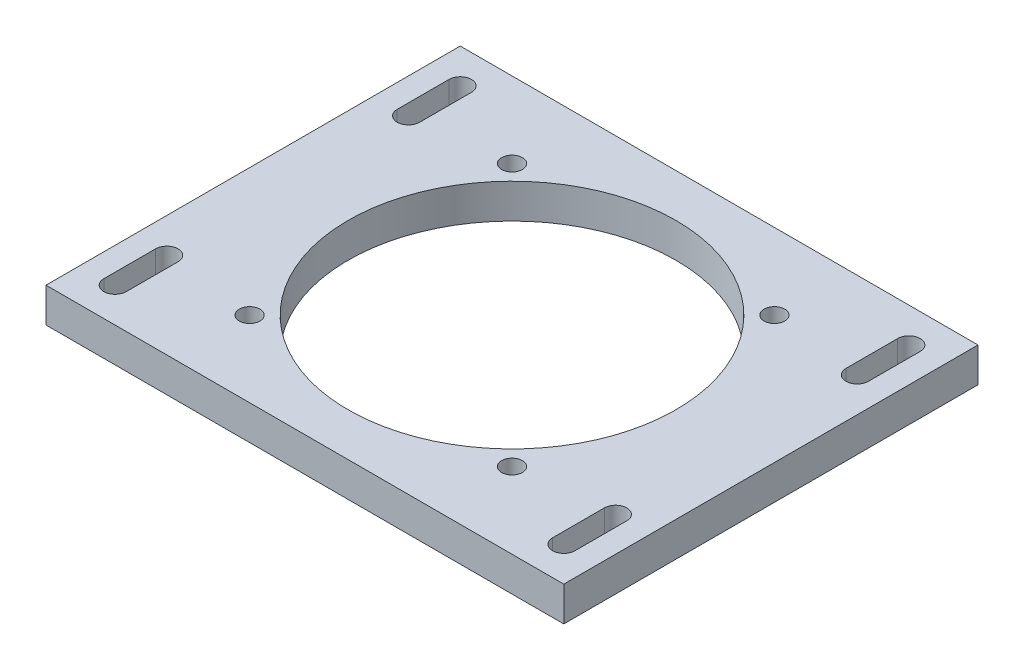
ISO-10303-21;
HEADER;
FILE_DESCRIPTION(('STEP AP214'),'2;1');
FILE_NAME('part.step','',(''),(''),'','','');
FILE_SCHEMA(('AUTOMOTIVE_DESIGN { 1 0 10303 214 1 1 1 1 }'));
ENDSEC;
DATA;
#1=APPLICATION_CONTEXT('core data for automotive mechanical design processes');
#2=APPLICATION_PROTOCOL_DEFINITION('international standard','automotive_design',2000,#1);
#3=PRODUCT_CONTEXT('',#1,'mechanical');
#4=PRODUCT('Part','Part','',(#3));
#5=PRODUCT_RELATED_PRODUCT_CATEGORY('part','',(#4));
#6=PRODUCT_DEFINITION_FORMATION('','',#4);
#7=PRODUCT_DEFINITION_CONTEXT('part definition',#1,'design');
#8=PRODUCT_DEFINITION('design','',#6,#7);
#9=PRODUCT_DEFINITION_SHAPE('','',#8);
#10=(LENGTH_UNIT() NAMED_UNIT(*) SI_UNIT(.MILLI.,.METRE.));
#11=(NAMED_UNIT(*) PLANE_ANGLE_UNIT() SI_UNIT($,.RADIAN.));
#12=(NAMED_UNIT(*) SI_UNIT($,.STERADIAN.) SOLID_ANGLE_UNIT());
#13=UNCERTAINTY_MEASURE_WITH_UNIT(LENGTH_MEASURE(1.E-05),#10,'distance_accuracy_value','');
#14=(GEOMETRIC_REPRESENTATION_CONTEXT(3) GLOBAL_UNCERTAINTY_ASSIGNED_CONTEXT((#13)) GLOBAL_UNIT_ASSIGNED_CONTEXT((#10,
#11,#12)) REPRESENTATION_CONTEXT('',''));
#15=CARTESIAN_POINT('',(0.,0.,0.));
#16=DIRECTION('',(0.,0.,1.));
#17=DIRECTION('',(1.,0.,0.));
#18=AXIS2_PLACEMENT_3D('',#15,#16,#17);
#19=CARTESIAN_POINT('',(0.,20.,0.));
#20=DIRECTION('',(0.,-1.,0.));
#21=DIRECTION('',(0.,0.,-1.));
#22=AXIS2_PLACEMENT_3D('',#19,#20,#21);
#23=PLANE('',#22);
#24=DIRECTION('',(0.,0.,-1.));
#25=VECTOR('',#24,1.);
#26=CARTESIAN_POINT('',(-123.5,20.,70.));
#27=LINE('',#26,#25);
#28=CARTESIAN_POINT('',(-123.5,20.,70.));
#29=VERTEX_POINT('',#28);
#30=CARTESIAN_POINT('',(-123.5,20.,100.));
#31=VERTEX_POINT('',#30);
#32=EDGE_CURVE('E160',#29,#31,#27,.F.);
#33=ORIENTED_EDGE('',*,*,#32,.T.);
#34=CARTESIAN_POINT('',(-130.,20.,100.));
#35=DIRECTION('',(0.,1.,0.));
#36=DIRECTION('',(0.,0.,1.));
#37=AXIS2_PLACEMENT_3D('',#34,#35,#36);
#38=CIRCLE('',#37,6.5);
#39=CARTESIAN_POINT('',(-136.5,20.,100.));
#40=VERTEX_POINT('',#39);
#41=EDGE_CURVE('E232',#31,#40,#38,.F.);
#42=ORIENTED_EDGE('',*,*,#41,.T.);
#43=DIRECTION('',(0.,0.,1.));
#44=VECTOR('',#43,1.);
#45=CARTESIAN_POINT('',(-136.5,20.,70.));
#46=LINE('',#45,#44);
#47=CARTESIAN_POINT('',(-136.5,20.,70.));
#48=VERTEX_POINT('',#47);
#49=EDGE_CURVE('E165',#40,#48,#46,.F.);
#50=ORIENTED_EDGE('',*,*,#49,.T.);
#51=CARTESIAN_POINT('',(-130.,20.,70.));
#52=DIRECTION('',(0.,1.,0.));
#53=DIRECTION('',(0.,0.,1.));
#54=AXIS2_PLACEMENT_3D('',#51,#52,#53);
#55=CIRCLE('',#54,6.5);
#56=EDGE_CURVE('E173',#48,#29,#55,.F.);
#57=ORIENTED_EDGE('',*,*,#56,.T.);
#58=EDGE_LOOP('',(#33,#42,#50,#57));
#59=FACE_BOUND('',#58,.T.);
#60=DIRECTION('',(0.,0.,-1.));
#61=VECTOR('',#60,1.);
#62=CARTESIAN_POINT('',(136.5,20.,70.));
#63=LINE('',#62,#61);
#64=CARTESIAN_POINT('',(136.5,20.,70.));
#65=VERTEX_POINT('',#64);
#66=CARTESIAN_POINT('',(136.5,20.,100.));
#67=VERTEX_POINT('',#66);
#68=EDGE_CURVE('E170',#65,#67,#63,.F.);
#69=ORIENTED_EDGE('',*,*,#68,.T.);
#70=CARTESIAN_POINT('',(130.,20.,100.));
#71=DIRECTION('',(0.,1.,0.));
#72=DIRECTION('',(0.,0.,1.));
#73=AXIS2_PLACEMENT_3D('',#70,#71,#72);
#74=CIRCLE('',#73,6.5);
#75=CARTESIAN_POINT('',(123.5,20.,100.));
#76=VERTEX_POINT('',#75);
#77=EDGE_CURVE('E236',#67,#76,#74,.F.);
#78=ORIENTED_EDGE('',*,*,#77,.T.);
#79=DIRECTION('',(0.,0.,1.));
#80=VECTOR('',#79,1.);
#81=CARTESIAN_POINT('',(123.5,20.,70.));
#82=LINE('',#81,#80);
#83=CARTESIAN_POINT('',(123.5,20.,70.));
#84=VERTEX_POINT('',#83);
#85=EDGE_CURVE('E175',#76,#84,#82,.F.);
#86=ORIENTED_EDGE('',*,*,#85,.T.);
#87=CARTESIAN_POINT('',(130.,20.,70.));
#88=DIRECTION('',(0.,1.,0.));
#89=DIRECTION('',(0.,0.,1.));
#90=AXIS2_PLACEMENT_3D('',#87,#88,#89);
#91=CIRCLE('',#90,6.5);
#92=EDGE_CURVE('E239',#84,#65,#91,.F.);
#93=ORIENTED_EDGE('',*,*,#92,.T.);
#94=EDGE_LOOP('',(#69,#78,#86,#93));
#95=FACE_BOUND('',#94,.T.);
#96=DIRECTION('',(1.,0.,0.));
#97=VECTOR('',#96,1.);
#98=CARTESIAN_POINT('',(-150.,20.,-120.));
#99=LINE('',#98,#97);
#100=CARTESIAN_POINT('',(150.,20.,-120.));
#101=VERTEX_POINT('',#100);
#102=CARTESIAN_POINT('',(-150.,20.,-120.));
#103=VERTEX_POINT('',#102);
#104=EDGE_CURVE('E578',#101,#103,#99,.F.);
#105=ORIENTED_EDGE('',*,*,#104,.T.);
#106=DIRECTION('',(0.,0.,-1.));
#107=VECTOR('',#106,1.);
#108=CARTESIAN_POINT('',(-150.,20.,120.));
#109=LINE('',#108,#107);
#110=CARTESIAN_POINT('',(-150.,20.,120.));
#111=VERTEX_POINT('',#110);
#112=EDGE_CURVE('E587',#103,#111,#109,.F.);
#113=ORIENTED_EDGE('',*,*,#112,.T.);
#114=DIRECTION('',(-1.,0.,0.));
#115=VECTOR('',#114,1.);
#116=CARTESIAN_POINT('',(-150.,20.,120.));
#117=LINE('',#116,#115);
#118=CARTESIAN_POINT('',(150.,20.,120.));
#119=VERTEX_POINT('',#118);
#120=EDGE_CURVE('E593',#111,#119,#117,.F.);
#121=ORIENTED_EDGE('',*,*,#120,.T.);
#122=DIRECTION('',(0.,0.,1.));
#123=VECTOR('',#122,1.);
#124=CARTESIAN_POINT('',(150.,20.,120.));
#125=LINE('',#124,#123);
#126=EDGE_CURVE('E183',#119,#101,#125,.F.);
#127=ORIENTED_EDGE('',*,*,#126,.T.);
#128=EDGE_LOOP('',(#105,#113,#121,#127));
#129=FACE_BOUND('',#128,.T.);
#130=CARTESIAN_POINT('',(130.,20.,-100.));
#131=DIRECTION('',(0.,1.,0.));
#132=DIRECTION('',(0.,0.,1.));
#133=AXIS2_PLACEMENT_3D('',#130,#131,#132);
#134=CIRCLE('',#133,6.5);
#135=CARTESIAN_POINT('',(123.5,20.,-100.));
#136=VERTEX_POINT('',#135);
#137=CARTESIAN_POINT('',(136.5,20.,-100.));
#138=VERTEX_POINT('',#137);
#139=EDGE_CURVE('E191',#136,#138,#134,.F.);
#140=ORIENTED_EDGE('',*,*,#139,.T.);
#141=DIRECTION('',(0.,0.,-1.));
#142=VECTOR('',#141,1.);
#143=CARTESIAN_POINT('',(136.5,20.,-100.));
#144=LINE('',#143,#142);
#145=CARTESIAN_POINT('',(136.5,20.,-70.));
#146=VERTEX_POINT('',#145);
#147=EDGE_CURVE('E180',#138,#146,#144,.F.);
#148=ORIENTED_EDGE('',*,*,#147,.T.);
#149=CARTESIAN_POINT('',(130.,20.,-70.));
#150=DIRECTION('',(0.,1.,0.));
#151=DIRECTION('',(0.,0.,1.));
#152=AXIS2_PLACEMENT_3D('',#149,#150,#151);
#153=CIRCLE('',#152,6.5);
#154=CARTESIAN_POINT('',(123.5,20.,-70.));
#155=VERTEX_POINT('',#154);
#156=EDGE_CURVE('E242',#146,#155,#153,.F.);
#157=ORIENTED_EDGE('',*,*,#156,.T.);
#158=DIRECTION('',(0.,0.,1.));
#159=VECTOR('',#158,1.);
#160=CARTESIAN_POINT('',(123.5,20.,-100.));
#161=LINE('',#160,#159);
#162=EDGE_CURVE('E185',#155,#136,#161,.F.);
#163=ORIENTED_EDGE('',*,*,#162,.T.);
#164=EDGE_LOOP('',(#140,#148,#157,#163));
#165=FACE_BOUND('',#164,.T.);
#166=CARTESIAN_POINT('',(-130.,20.,-100.));
#167=DIRECTION('',(0.,1.,0.));
#168=DIRECTION('',(0.,0.,1.));
#169=AXIS2_PLACEMENT_3D('',#166,#167,#168);
#170=CIRCLE('',#169,6.5);
#171=CARTESIAN_POINT('',(-136.5,20.,-100.));
#172=VERTEX_POINT('',#171);
#173=CARTESIAN_POINT('',(-123.5,20.,-100.));
#174=VERTEX_POINT('',#173);
#175=EDGE_CURVE('E131',#172,#174,#170,.F.);
#176=ORIENTED_EDGE('',*,*,#175,.T.);
#177=DIRECTION('',(0.,0.,-1.));
#178=VECTOR('',#177,1.);
#179=CARTESIAN_POINT('',(-123.5,20.,-100.));
#180=LINE('',#179,#178);
#181=CARTESIAN_POINT('',(-123.5,20.,-70.));
#182=VERTEX_POINT('',#181);
#183=EDGE_CURVE('E190',#174,#182,#180,.F.);
#184=ORIENTED_EDGE('',*,*,#183,.T.);
#185=CARTESIAN_POINT('',(-130.,20.,-70.));
#186=DIRECTION('',(0.,1.,0.));
#187=DIRECTION('',(0.,0.,1.));
#188=AXIS2_PLACEMENT_3D('',#185,#186,#187);
#189=CIRCLE('',#188,6.5);
#190=CARTESIAN_POINT('',(-136.5,20.,-70.));
#191=VERTEX_POINT('',#190);
#192=EDGE_CURVE('E147',#182,#191,#189,.F.);
#193=ORIENTED_EDGE('',*,*,#192,.T.);
#194=DIRECTION('',(0.,0.,1.));
#195=VECTOR('',#194,1.);
#196=CARTESIAN_POINT('',(-136.5,20.,-100.));
#197=LINE('',#196,#195);
#198=EDGE_CURVE('E145',#191,#172,#197,.F.);
#199=ORIENTED_EDGE('',*,*,#198,.T.);
#200=EDGE_LOOP('',(#176,#184,#193,#199));
#201=FACE_BOUND('',#200,.T.);
#202=CARTESIAN_POINT('',(0.,20.,0.));
#203=DIRECTION('',(0.,-1.,0.));
#204=DIRECTION('',(0.,0.,-1.));
#205=AXIS2_PLACEMENT_3D('',#202,#203,#204);
#206=CIRCLE('',#205,95.);
#207=CARTESIAN_POINT('',(0.,20.,-95.));
#208=VERTEX_POINT('',#207);
#209=EDGE_CURVE('E142',#208,#208,#206,.T.);
#210=ORIENTED_EDGE('',*,*,#209,.T.);
#211=EDGE_LOOP('',(#210));
#212=FACE_BOUND('',#211,.T.);
#213=CARTESIAN_POINT('',(76.013978977554,20.,76.0139789775537));
#214=DIRECTION('',(0.,-1.,0.));
#215=DIRECTION('',(0.,0.,-1.));
#216=AXIS2_PLACEMENT_3D('',#213,#214,#215);
#217=CIRCLE('',#216,6.);
#218=CARTESIAN_POINT('',(76.013978977554,20.,70.0139789775537));
#219=VERTEX_POINT('',#218);
#220=EDGE_CURVE('E250',#219,#219,#217,.T.);
#221=ORIENTED_EDGE('',*,*,#220,.T.);
#222=EDGE_LOOP('',(#221));
#223=FACE_BOUND('',#222,.T.);
#224=CARTESIAN_POINT('',(-76.013978977554,20.,76.0139789775537));
#225=DIRECTION('',(0.,-1.,0.));
#226=DIRECTION('',(0.,0.,-1.));
#227=AXIS2_PLACEMENT_3D('',#224,#225,#226);
#228=CIRCLE('',#227,6.);
#229=CARTESIAN_POINT('',(-76.013978977554,20.,70.0139789775537));
#230=VERTEX_POINT('',#229);
#231=EDGE_CURVE('E253',#230,#230,#228,.T.);
#232=ORIENTED_EDGE('',*,*,#231,.T.);
#233=EDGE_LOOP('',(#232));
#234=FACE_BOUND('',#233,.T.);
#235=CARTESIAN_POINT('',(-76.013978977554,20.,-76.0139789775537));
#236=DIRECTION('',(0.,-1.,0.));
#237=DIRECTION('',(0.,0.,-1.));
#238=AXIS2_PLACEMENT_3D('',#235,#236,#237);
#239=CIRCLE('',#238,6.);
#240=CARTESIAN_POINT('',(-76.013978977554,20.,-82.0139789775537));
#241=VERTEX_POINT('',#240);
#242=EDGE_CURVE('E255',#241,#241,#239,.T.);
#243=ORIENTED_EDGE('',*,*,#242,.T.);
#244=EDGE_LOOP('',(#243));
#245=FACE_BOUND('',#244,.T.);
#246=CARTESIAN_POINT('',(76.0139789775545,20.,-76.0139789775532));
#247=DIRECTION('',(0.,-1.,0.));
#248=DIRECTION('',(0.,0.,-1.));
#249=AXIS2_PLACEMENT_3D('',#246,#247,#248);
#250=CIRCLE('',#249,6.);
#251=CARTESIAN_POINT('',(76.0139789775545,20.,-82.0139789775532));
#252=VERTEX_POINT('',#251);
#253=EDGE_CURVE('E19',#252,#252,#250,.T.);
#254=ORIENTED_EDGE('',*,*,#253,.T.);
#255=EDGE_LOOP('',(#254));
#256=FACE_BOUND('',#255,.T.);
#257=ADVANCED_FACE('F16',(#59,#95,#129,#165,#201,#212,#223,#234,#245,#256),#23,.F.);
#258=CARTESIAN_POINT('',(76.0139789775545,0.,-76.0139789775532));
#259=DIRECTION('',(0.,-1.,0.));
#260=DIRECTION('',(0.,0.,-1.));
#261=AXIS2_PLACEMENT_3D('',#258,#259,#260);
#262=CYLINDRICAL_SURFACE('',#261,6.);
#263=CARTESIAN_POINT('',(76.0139789775545,0.,-76.0139789775532));
#264=DIRECTION('',(0.,-1.,0.));
#265=DIRECTION('',(0.,0.,-1.));
#266=AXIS2_PLACEMENT_3D('',#263,#264,#265);
#267=CIRCLE('',#266,6.);
#268=CARTESIAN_POINT('',(76.0139789775545,0.,-82.0139789775532));
#269=VERTEX_POINT('',#268);
#270=EDGE_CURVE('E163',#269,#269,#267,.F.);
#271=ORIENTED_EDGE('',*,*,#270,.F.);
#272=EDGE_LOOP('',(#271));
#273=FACE_BOUND('',#272,.T.);
#274=ORIENTED_EDGE('',*,*,#253,.F.);
#275=EDGE_LOOP('',(#274));
#276=FACE_BOUND('',#275,.T.);
#277=ADVANCED_FACE('F263',(#273,#276),#262,.F.);
#278=CARTESIAN_POINT('',(-76.013978977554,0.,-76.0139789775537));
#279=DIRECTION('',(0.,-1.,0.));
#280=DIRECTION('',(0.,0.,-1.));
#281=AXIS2_PLACEMENT_3D('',#278,#279,#280);
#282=CYLINDRICAL_SURFACE('',#281,6.);
#283=CARTESIAN_POINT('',(-76.013978977554,0.,-76.0139789775537));
#284=DIRECTION('',(0.,-1.,0.));
#285=DIRECTION('',(0.,0.,-1.));
#286=AXIS2_PLACEMENT_3D('',#283,#284,#285);
#287=CIRCLE('',#286,6.);
#288=CARTESIAN_POINT('',(-76.013978977554,0.,-82.0139789775537));
#289=VERTEX_POINT('',#288);
#290=EDGE_CURVE('E227',#289,#289,#287,.F.);
#291=ORIENTED_EDGE('',*,*,#290,.F.);
#292=EDGE_LOOP('',(#291));
#293=FACE_BOUND('',#292,.T.);
#294=ORIENTED_EDGE('',*,*,#242,.F.);
#295=EDGE_LOOP('',(#294));
#296=FACE_BOUND('',#295,.T.);
#297=ADVANCED_FACE('F265',(#293,#296),#282,.F.);
#298=CARTESIAN_POINT('',(-76.013978977554,0.,76.0139789775537));
#299=DIRECTION('',(0.,-1.,0.));
#300=DIRECTION('',(0.,0.,-1.));
#301=AXIS2_PLACEMENT_3D('',#298,#299,#300);
#302=CYLINDRICAL_SURFACE('',#301,6.);
#303=CARTESIAN_POINT('',(-76.013978977554,0.,76.0139789775537));
#304=DIRECTION('',(0.,-1.,0.));
#305=DIRECTION('',(0.,0.,-1.));
#306=AXIS2_PLACEMENT_3D('',#303,#304,#305);
#307=CIRCLE('',#306,6.);
#308=CARTESIAN_POINT('',(-76.013978977554,0.,70.0139789775537));
#309=VERTEX_POINT('',#308);
#310=EDGE_CURVE('E224',#309,#309,#307,.F.);
#311=ORIENTED_EDGE('',*,*,#310,.F.);
#312=EDGE_LOOP('',(#311));
#313=FACE_BOUND('',#312,.T.);
#314=ORIENTED_EDGE('',*,*,#231,.F.);
#315=EDGE_LOOP('',(#314));
#316=FACE_BOUND('',#315,.T.);
#317=ADVANCED_FACE('F273',(#313,#316),#302,.F.);
#318=CARTESIAN_POINT('',(76.013978977554,0.,76.0139789775537));
#319=DIRECTION('',(0.,-1.,0.));
#320=DIRECTION('',(0.,0.,-1.));
#321=AXIS2_PLACEMENT_3D('',#318,#319,#320);
#322=CYLINDRICAL_SURFACE('',#321,6.);
#323=CARTESIAN_POINT('',(76.013978977554,0.,76.0139789775537));
#324=DIRECTION('',(0.,-1.,0.));
#325=DIRECTION('',(0.,0.,-1.));
#326=AXIS2_PLACEMENT_3D('',#323,#324,#325);
#327=CIRCLE('',#326,6.);
#328=CARTESIAN_POINT('',(76.013978977554,0.,70.0139789775537));
#329=VERTEX_POINT('',#328);
#330=EDGE_CURVE('E221',#329,#329,#327,.F.);
#331=ORIENTED_EDGE('',*,*,#330,.F.);
#332=EDGE_LOOP('',(#331));
#333=FACE_BOUND('',#332,.T.);
#334=ORIENTED_EDGE('',*,*,#220,.F.);
#335=EDGE_LOOP('',(#334));
#336=FACE_BOUND('',#335,.T.);
#337=ADVANCED_FACE('F365',(#333,#336),#322,.F.);
#338=CARTESIAN_POINT('',(0.,20.,0.));
#339=DIRECTION('',(0.,-1.,0.));
#340=DIRECTION('',(0.,0.,-1.));
#341=AXIS2_PLACEMENT_3D('',#338,#339,#340);
#342=CYLINDRICAL_SURFACE('',#341,95.);
#343=CARTESIAN_POINT('',(0.,0.,0.));
#344=DIRECTION('',(0.,-1.,0.));
#345=DIRECTION('',(0.,0.,-1.));
#346=AXIS2_PLACEMENT_3D('',#343,#344,#345);
#347=CIRCLE('',#346,95.);
#348=CARTESIAN_POINT('',(0.,0.,-95.));
#349=VERTEX_POINT('',#348);
#350=EDGE_CURVE('E218',#349,#349,#347,.F.);
#351=ORIENTED_EDGE('',*,*,#350,.F.);
#352=EDGE_LOOP('',(#351));
#353=FACE_BOUND('',#352,.T.);
#354=ORIENTED_EDGE('',*,*,#209,.F.);
#355=EDGE_LOOP('',(#354));
#356=FACE_BOUND('',#355,.T.);
#357=ADVANCED_FACE('F362',(#353,#356),#342,.F.);
#358=CARTESIAN_POINT('',(-130.,0.,-100.));
#359=DIRECTION('',(0.,1.,0.));
#360=DIRECTION('',(0.,0.,1.));
#361=AXIS2_PLACEMENT_3D('',#358,#359,#360);
#362=CYLINDRICAL_SURFACE('',#361,6.5);
#363=DIRECTION('',(0.,1.,0.));
#364=VECTOR('',#363,1.);
#365=CARTESIAN_POINT('',(-136.5,0.,-100.));
#366=LINE('',#365,#364);
#367=CARTESIAN_POINT('',(-136.5,0.,-100.));
#368=VERTEX_POINT('',#367);
#369=EDGE_CURVE('E135',#172,#368,#366,.F.);
#370=ORIENTED_EDGE('',*,*,#369,.T.);
#371=CARTESIAN_POINT('',(-130.,0.,-100.));
#372=DIRECTION('',(0.,1.,0.));
#373=DIRECTION('',(0.,0.,1.));
#374=AXIS2_PLACEMENT_3D('',#371,#372,#373);
#375=CIRCLE('',#374,6.5);
#376=CARTESIAN_POINT('',(-123.5,0.,-100.));
#377=VERTEX_POINT('',#376);
#378=EDGE_CURVE('E216',#377,#368,#375,.T.);
#379=ORIENTED_EDGE('',*,*,#378,.F.);
#380=DIRECTION('',(0.,1.,0.));
#381=VECTOR('',#380,1.);
#382=CARTESIAN_POINT('',(-123.5,0.,-100.));
#383=LINE('',#382,#381);
#384=EDGE_CURVE('E138',#377,#174,#383,.T.);
#385=ORIENTED_EDGE('',*,*,#384,.T.);
#386=ORIENTED_EDGE('',*,*,#175,.F.);
#387=EDGE_LOOP('',(#370,#379,#385,#386));
#388=FACE_BOUND('',#387,.T.);
#389=ADVANCED_FACE('F133',(#388),#362,.F.);
#390=CARTESIAN_POINT('',(-136.5,0.,-100.));
#391=DIRECTION('',(-1.,0.,0.));
#392=DIRECTION('',(0.,0.,1.));
#393=AXIS2_PLACEMENT_3D('',#390,#391,#392);
#394=PLANE('',#393);
#395=DIRECTION('',(0.,1.,0.));
#396=VECTOR('',#395,1.);
#397=CARTESIAN_POINT('',(-136.5,0.,-70.));
#398=LINE('',#397,#396);
#399=CARTESIAN_POINT('',(-136.5,0.,-70.));
#400=VERTEX_POINT('',#399);
#401=EDGE_CURVE('E150',#191,#400,#398,.F.);
#402=ORIENTED_EDGE('',*,*,#401,.T.);
#403=DIRECTION('',(0.,0.,-1.));
#404=VECTOR('',#403,1.);
#405=CARTESIAN_POINT('',(-136.5,0.,0.));
#406=LINE('',#405,#404);
#407=EDGE_CURVE('E154',#368,#400,#406,.F.);
#408=ORIENTED_EDGE('',*,*,#407,.F.);
#409=ORIENTED_EDGE('',*,*,#369,.F.);
#410=ORIENTED_EDGE('',*,*,#198,.F.);
#411=EDGE_LOOP('',(#402,#408,#409,#410));
#412=FACE_BOUND('',#411,.T.);
#413=ADVANCED_FACE('F152',(#412),#394,.F.);
#414=CARTESIAN_POINT('',(-130.,0.,-70.));
#415=DIRECTION('',(0.,1.,0.));
#416=DIRECTION('',(0.,0.,1.));
#417=AXIS2_PLACEMENT_3D('',#414,#415,#416);
#418=CYLINDRICAL_SURFACE('',#417,6.5);
#419=DIRECTION('',(0.,1.,0.));
#420=VECTOR('',#419,1.);
#421=CARTESIAN_POINT('',(-123.5,0.,-70.));
#422=LINE('',#421,#420);
#423=CARTESIAN_POINT('',(-123.5,0.,-70.));
#424=VERTEX_POINT('',#423);
#425=EDGE_CURVE('E246',#182,#424,#422,.F.);
#426=ORIENTED_EDGE('',*,*,#425,.T.);
#427=CARTESIAN_POINT('',(-130.,0.,-70.));
#428=DIRECTION('',(0.,1.,0.));
#429=DIRECTION('',(0.,0.,1.));
#430=AXIS2_PLACEMENT_3D('',#427,#428,#429);
#431=CIRCLE('',#430,6.5);
#432=EDGE_CURVE('E214',#400,#424,#431,.T.);
#433=ORIENTED_EDGE('',*,*,#432,.F.);
#434=ORIENTED_EDGE('',*,*,#401,.F.);
#435=ORIENTED_EDGE('',*,*,#192,.F.);
#436=EDGE_LOOP('',(#426,#433,#434,#435));
#437=FACE_BOUND('',#436,.T.);
#438=ADVANCED_FACE('F353',(#437),#418,.F.);
#439=CARTESIAN_POINT('',(-123.5,0.,-100.));
#440=DIRECTION('',(1.,0.,0.));
#441=DIRECTION('',(0.,0.,-1.));
#442=AXIS2_PLACEMENT_3D('',#439,#440,#441);
#443=PLANE('',#442);
#444=ORIENTED_EDGE('',*,*,#384,.F.);
#445=DIRECTION('',(0.,0.,-1.));
#446=VECTOR('',#445,1.);
#447=CARTESIAN_POINT('',(-123.5,0.,0.));
#448=LINE('',#447,#446);
#449=EDGE_CURVE('E213',#424,#377,#448,.T.);
#450=ORIENTED_EDGE('',*,*,#449,.F.);
#451=ORIENTED_EDGE('',*,*,#425,.F.);
#452=ORIENTED_EDGE('',*,*,#183,.F.);
#453=EDGE_LOOP('',(#444,#450,#451,#452));
#454=FACE_BOUND('',#453,.T.);
#455=ADVANCED_FACE('F349',(#454),#443,.F.);
#456=CARTESIAN_POINT('',(130.,0.,-100.));
#457=DIRECTION('',(0.,1.,0.));
#458=DIRECTION('',(0.,0.,1.));
#459=AXIS2_PLACEMENT_3D('',#456,#457,#458);
#460=CYLINDRICAL_SURFACE('',#459,6.5);
#461=DIRECTION('',(0.,1.,0.));
#462=VECTOR('',#461,1.);
#463=CARTESIAN_POINT('',(123.5,0.,-100.));
#464=LINE('',#463,#462);
#465=CARTESIAN_POINT('',(123.5,0.,-100.));
#466=VERTEX_POINT('',#465);
#467=EDGE_CURVE('E189',#136,#466,#464,.F.);
#468=ORIENTED_EDGE('',*,*,#467,.T.);
#469=CARTESIAN_POINT('',(130.,0.,-100.));
#470=DIRECTION('',(0.,1.,0.));
#471=DIRECTION('',(0.,0.,1.));
#472=AXIS2_PLACEMENT_3D('',#469,#470,#471);
#473=CIRCLE('',#472,6.5);
#474=CARTESIAN_POINT('',(136.5,0.,-100.));
#475=VERTEX_POINT('',#474);
#476=EDGE_CURVE('E210',#475,#466,#473,.T.);
#477=ORIENTED_EDGE('',*,*,#476,.F.);
#478=DIRECTION('',(0.,1.,0.));
#479=VECTOR('',#478,1.);
#480=CARTESIAN_POINT('',(136.5,0.,-100.));
#481=LINE('',#480,#479);
#482=EDGE_CURVE('E184',#475,#138,#481,.T.);
#483=ORIENTED_EDGE('',*,*,#482,.T.);
#484=ORIENTED_EDGE('',*,*,#139,.F.);
#485=EDGE_LOOP('',(#468,#477,#483,#484));
#486=FACE_BOUND('',#485,.T.);
#487=ADVANCED_FACE('F345',(#486),#460,.F.);
#488=CARTESIAN_POINT('',(123.5,0.,-100.));
#489=DIRECTION('',(-1.,0.,0.));
#490=DIRECTION('',(0.,0.,1.));
#491=AXIS2_PLACEMENT_3D('',#488,#489,#490);
#492=PLANE('',#491);
#493=DIRECTION('',(0.,1.,0.));
#494=VECTOR('',#493,1.);
#495=CARTESIAN_POINT('',(123.5,0.,-70.));
#496=LINE('',#495,#494);
#497=CARTESIAN_POINT('',(123.5,0.,-70.));
#498=VERTEX_POINT('',#497);
#499=EDGE_CURVE('E188',#155,#498,#496,.F.);
#500=ORIENTED_EDGE('',*,*,#499,.T.);
#501=DIRECTION('',(0.,0.,-1.));
#502=VECTOR('',#501,1.);
#503=CARTESIAN_POINT('',(123.5,0.,0.));
#504=LINE('',#503,#502);
#505=EDGE_CURVE('E209',#466,#498,#504,.F.);
#506=ORIENTED_EDGE('',*,*,#505,.F.);
#507=ORIENTED_EDGE('',*,*,#467,.F.);
#508=ORIENTED_EDGE('',*,*,#162,.F.);
#509=EDGE_LOOP('',(#500,#506,#507,#508));
#510=FACE_BOUND('',#509,.T.);
#511=ADVANCED_FACE('F341',(#510),#492,.F.);
#512=CARTESIAN_POINT('',(130.,0.,-70.));
#513=DIRECTION('',(0.,1.,0.));
#514=DIRECTION('',(0.,0.,1.));
#515=AXIS2_PLACEMENT_3D('',#512,#513,#514);
#516=CYLINDRICAL_SURFACE('',#515,6.5);
#517=DIRECTION('',(0.,1.,0.));
#518=VECTOR('',#517,1.);
#519=CARTESIAN_POINT('',(136.5,0.,-70.));
#520=LINE('',#519,#518);
#521=CARTESIAN_POINT('',(136.5,0.,-70.));
#522=VERTEX_POINT('',#521);
#523=EDGE_CURVE('E244',#146,#522,#520,.F.);
#524=ORIENTED_EDGE('',*,*,#523,.T.);
#525=CARTESIAN_POINT('',(130.,0.,-70.));
#526=DIRECTION('',(0.,1.,0.));
#527=DIRECTION('',(0.,0.,1.));
#528=AXIS2_PLACEMENT_3D('',#525,#526,#527);
#529=CIRCLE('',#528,6.5);
#530=EDGE_CURVE('E206',#498,#522,#529,.T.);
#531=ORIENTED_EDGE('',*,*,#530,.F.);
#532=ORIENTED_EDGE('',*,*,#499,.F.);
#533=ORIENTED_EDGE('',*,*,#156,.F.);
#534=EDGE_LOOP('',(#524,#531,#532,#533));
#535=FACE_BOUND('',#534,.T.);
#536=ADVANCED_FACE('F337',(#535),#516,.F.);
#537=CARTESIAN_POINT('',(136.5,0.,-100.));
#538=DIRECTION('',(1.,0.,0.));
#539=DIRECTION('',(0.,0.,-1.));
#540=AXIS2_PLACEMENT_3D('',#537,#538,#539);
#541=PLANE('',#540);
#542=ORIENTED_EDGE('',*,*,#482,.F.);
#543=DIRECTION('',(0.,0.,-1.));
#544=VECTOR('',#543,1.);
#545=CARTESIAN_POINT('',(136.5,0.,0.));
#546=LINE('',#545,#544);
#547=EDGE_CURVE('E208',#522,#475,#546,.T.);
#548=ORIENTED_EDGE('',*,*,#547,.F.);
#549=ORIENTED_EDGE('',*,*,#523,.F.);
#550=ORIENTED_EDGE('',*,*,#147,.F.);
#551=EDGE_LOOP('',(#542,#548,#549,#550));
#552=FACE_BOUND('',#551,.T.);
#553=ADVANCED_FACE('F333',(#552),#541,.F.);
#554=CARTESIAN_POINT('',(150.,20.,120.));
#555=DIRECTION('',(-1.,0.,0.));
#556=DIRECTION('',(0.,0.,1.));
#557=AXIS2_PLACEMENT_3D('',#554,#555,#556);
#558=PLANE('',#557);
#559=DIRECTION('',(0.,1.,0.));
#560=VECTOR('',#559,1.);
#561=CARTESIAN_POINT('',(150.,20.,-120.));
#562=LINE('',#561,#560);
#563=CARTESIAN_POINT('',(150.,0.,-120.));
#564=VERTEX_POINT('',#563);
#565=EDGE_CURVE('E581',#564,#101,#562,.T.);
#566=ORIENTED_EDGE('',*,*,#565,.T.);
#567=ORIENTED_EDGE('',*,*,#126,.F.);
#568=DIRECTION('',(0.,1.,0.));
#569=VECTOR('',#568,1.);
#570=CARTESIAN_POINT('',(150.,20.,120.));
#571=LINE('',#570,#569);
#572=CARTESIAN_POINT('',(150.,0.,120.));
#573=VERTEX_POINT('',#572);
#574=EDGE_CURVE('E590',#119,#573,#571,.F.);
#575=ORIENTED_EDGE('',*,*,#574,.T.);
#576=DIRECTION('',(0.,0.,-1.));
#577=VECTOR('',#576,1.);
#578=CARTESIAN_POINT('',(150.,0.,0.));
#579=LINE('',#578,#577);
#580=EDGE_CURVE('E614',#564,#573,#579,.F.);
#581=ORIENTED_EDGE('',*,*,#580,.F.);
#582=EDGE_LOOP('',(#566,#567,#575,#581));
#583=FACE_BOUND('',#582,.T.);
#584=ADVANCED_FACE('F329',(#583),#558,.F.);
#585=CARTESIAN_POINT('',(-150.,20.,120.));
#586=DIRECTION('',(0.,0.,-1.));
#587=DIRECTION('',(-1.,0.,0.));
#588=AXIS2_PLACEMENT_3D('',#585,#586,#587);
#589=PLANE('',#588);
#590=ORIENTED_EDGE('',*,*,#574,.F.);
#591=ORIENTED_EDGE('',*,*,#120,.F.);
#592=DIRECTION('',(0.,1.,0.));
#593=VECTOR('',#592,1.);
#594=CARTESIAN_POINT('',(-150.,20.,120.));
#595=LINE('',#594,#593);
#596=CARTESIAN_POINT('',(-150.,0.,120.));
#597=VERTEX_POINT('',#596);
#598=EDGE_CURVE('E584',#111,#597,#595,.F.);
#599=ORIENTED_EDGE('',*,*,#598,.T.);
#600=DIRECTION('',(1.,0.,0.));
#601=VECTOR('',#600,1.);
#602=CARTESIAN_POINT('',(0.,0.,120.));
#603=LINE('',#602,#601);
#604=EDGE_CURVE('E616',#573,#597,#603,.F.);
#605=ORIENTED_EDGE('',*,*,#604,.F.);
#606=EDGE_LOOP('',(#590,#591,#599,#605));
#607=FACE_BOUND('',#606,.T.);
#608=ADVANCED_FACE('F325',(#607),#589,.F.);
#609=CARTESIAN_POINT('',(-150.,20.,120.));
#610=DIRECTION('',(1.,0.,0.));
#611=DIRECTION('',(0.,0.,-1.));
#612=AXIS2_PLACEMENT_3D('',#609,#610,#611);
#613=PLANE('',#612);
#614=ORIENTED_EDGE('',*,*,#598,.F.);
#615=ORIENTED_EDGE('',*,*,#112,.F.);
#616=DIRECTION('',(0.,1.,0.));
#617=VECTOR('',#616,1.);
#618=CARTESIAN_POINT('',(-150.,20.,-120.));
#619=LINE('',#618,#617);
#620=CARTESIAN_POINT('',(-150.,0.,-120.));
#621=VERTEX_POINT('',#620);
#622=EDGE_CURVE('E241',#103,#621,#619,.F.);
#623=ORIENTED_EDGE('',*,*,#622,.T.);
#624=DIRECTION('',(0.,0.,-1.));
#625=VECTOR('',#624,1.);
#626=CARTESIAN_POINT('',(-150.,0.,0.));
#627=LINE('',#626,#625);
#628=EDGE_CURVE('E621',#597,#621,#627,.T.);
#629=ORIENTED_EDGE('',*,*,#628,.F.);
#630=EDGE_LOOP('',(#614,#615,#623,#629));
#631=FACE_BOUND('',#630,.T.);
#632=ADVANCED_FACE('F321',(#631),#613,.F.);
#633=CARTESIAN_POINT('',(-150.,20.,-120.));
#634=DIRECTION('',(0.,0.,1.));
#635=DIRECTION('',(1.,0.,0.));
#636=AXIS2_PLACEMENT_3D('',#633,#634,#635);
#637=PLANE('',#636);
#638=ORIENTED_EDGE('',*,*,#622,.F.);
#639=ORIENTED_EDGE('',*,*,#104,.F.);
#640=ORIENTED_EDGE('',*,*,#565,.F.);
#641=DIRECTION('',(1.,0.,0.));
#642=VECTOR('',#641,1.);
#643=CARTESIAN_POINT('',(0.,0.,-120.));
#644=LINE('',#643,#642);
#645=EDGE_CURVE('E205',#621,#564,#644,.T.);
#646=ORIENTED_EDGE('',*,*,#645,.F.);
#647=EDGE_LOOP('',(#638,#639,#640,#646));
#648=FACE_BOUND('',#647,.T.);
#649=ADVANCED_FACE('F317',(#648),#637,.F.);
#650=CARTESIAN_POINT('',(130.,0.,70.));
#651=DIRECTION('',(0.,1.,0.));
#652=DIRECTION('',(0.,0.,1.));
#653=AXIS2_PLACEMENT_3D('',#650,#651,#652);
#654=CYLINDRICAL_SURFACE('',#653,6.5);
#655=DIRECTION('',(0.,1.,0.));
#656=VECTOR('',#655,1.);
#657=CARTESIAN_POINT('',(123.5,0.,70.));
#658=LINE('',#657,#656);
#659=CARTESIAN_POINT('',(123.5,0.,70.));
#660=VERTEX_POINT('',#659);
#661=EDGE_CURVE('E179',#84,#660,#658,.F.);
#662=ORIENTED_EDGE('',*,*,#661,.T.);
#663=CARTESIAN_POINT('',(130.,0.,70.));
#664=DIRECTION('',(0.,1.,0.));
#665=DIRECTION('',(0.,0.,1.));
#666=AXIS2_PLACEMENT_3D('',#663,#664,#665);
#667=CIRCLE('',#666,6.5);
#668=CARTESIAN_POINT('',(136.5,0.,70.));
#669=VERTEX_POINT('',#668);
#670=EDGE_CURVE('E202',#669,#660,#667,.T.);
#671=ORIENTED_EDGE('',*,*,#670,.F.);
#672=DIRECTION('',(0.,1.,0.));
#673=VECTOR('',#672,1.);
#674=CARTESIAN_POINT('',(136.5,0.,70.));
#675=LINE('',#674,#673);
#676=EDGE_CURVE('E174',#669,#65,#675,.T.);
#677=ORIENTED_EDGE('',*,*,#676,.T.);
#678=ORIENTED_EDGE('',*,*,#92,.F.);
#679=EDGE_LOOP('',(#662,#671,#677,#678));
#680=FACE_BOUND('',#679,.T.);
#681=ADVANCED_FACE('F313',(#680),#654,.F.);
#682=CARTESIAN_POINT('',(123.5,0.,70.));
#683=DIRECTION('',(-1.,0.,0.));
#684=DIRECTION('',(0.,0.,1.));
#685=AXIS2_PLACEMENT_3D('',#682,#683,#684);
#686=PLANE('',#685);
#687=DIRECTION('',(0.,1.,0.));
#688=VECTOR('',#687,1.);
#689=CARTESIAN_POINT('',(123.5,0.,100.));
#690=LINE('',#689,#688);
#691=CARTESIAN_POINT('',(123.5,0.,100.));
#692=VERTEX_POINT('',#691);
#693=EDGE_CURVE('E178',#76,#692,#690,.F.);
#694=ORIENTED_EDGE('',*,*,#693,.T.);
#695=DIRECTION('',(0.,0.,-1.));
#696=VECTOR('',#695,1.);
#697=CARTESIAN_POINT('',(123.5,0.,0.));
#698=LINE('',#697,#696);
#699=EDGE_CURVE('E201',#660,#692,#698,.F.);
#700=ORIENTED_EDGE('',*,*,#699,.F.);
#701=ORIENTED_EDGE('',*,*,#661,.F.);
#702=ORIENTED_EDGE('',*,*,#85,.F.);
#703=EDGE_LOOP('',(#694,#700,#701,#702));
#704=FACE_BOUND('',#703,.T.);
#705=ADVANCED_FACE('F309',(#704),#686,.F.);
#706=CARTESIAN_POINT('',(130.,0.,100.));
#707=DIRECTION('',(0.,1.,0.));
#708=DIRECTION('',(0.,0.,1.));
#709=AXIS2_PLACEMENT_3D('',#706,#707,#708);
#710=CYLINDRICAL_SURFACE('',#709,6.5);
#711=DIRECTION('',(0.,1.,0.));
#712=VECTOR('',#711,1.);
#713=CARTESIAN_POINT('',(136.5,0.,100.));
#714=LINE('',#713,#712);
#715=CARTESIAN_POINT('',(136.5,0.,100.));
#716=VERTEX_POINT('',#715);
#717=EDGE_CURVE('E238',#67,#716,#714,.F.);
#718=ORIENTED_EDGE('',*,*,#717,.T.);
#719=CARTESIAN_POINT('',(130.,0.,100.));
#720=DIRECTION('',(0.,1.,0.));
#721=DIRECTION('',(0.,0.,1.));
#722=AXIS2_PLACEMENT_3D('',#719,#720,#721);
#723=CIRCLE('',#722,6.5);
#724=EDGE_CURVE('E199',#692,#716,#723,.T.);
#725=ORIENTED_EDGE('',*,*,#724,.F.);
#726=ORIENTED_EDGE('',*,*,#693,.F.);
#727=ORIENTED_EDGE('',*,*,#77,.F.);
#728=EDGE_LOOP('',(#718,#725,#726,#727));
#729=FACE_BOUND('',#728,.T.);
#730=ADVANCED_FACE('F305',(#729),#710,.F.);
#731=CARTESIAN_POINT('',(136.5,0.,70.));
#732=DIRECTION('',(1.,0.,0.));
#733=DIRECTION('',(0.,0.,-1.));
#734=AXIS2_PLACEMENT_3D('',#731,#732,#733);
#735=PLANE('',#734);
#736=ORIENTED_EDGE('',*,*,#676,.F.);
#737=DIRECTION('',(0.,0.,-1.));
#738=VECTOR('',#737,1.);
#739=CARTESIAN_POINT('',(136.5,0.,0.));
#740=LINE('',#739,#738);
#741=EDGE_CURVE('E198',#716,#669,#740,.T.);
#742=ORIENTED_EDGE('',*,*,#741,.F.);
#743=ORIENTED_EDGE('',*,*,#717,.F.);
#744=ORIENTED_EDGE('',*,*,#68,.F.);
#745=EDGE_LOOP('',(#736,#742,#743,#744));
#746=FACE_BOUND('',#745,.T.);
#747=ADVANCED_FACE('F301',(#746),#735,.F.);
#748=CARTESIAN_POINT('',(-130.,0.,70.));
#749=DIRECTION('',(0.,1.,0.));
#750=DIRECTION('',(0.,0.,1.));
#751=AXIS2_PLACEMENT_3D('',#748,#749,#750);
#752=CYLINDRICAL_SURFACE('',#751,6.5);
#753=DIRECTION('',(0.,1.,0.));
#754=VECTOR('',#753,1.);
#755=CARTESIAN_POINT('',(-136.5,0.,70.));
#756=LINE('',#755,#754);
#757=CARTESIAN_POINT('',(-136.5,0.,70.));
#758=VERTEX_POINT('',#757);
#759=EDGE_CURVE('E169',#48,#758,#756,.F.);
#760=ORIENTED_EDGE('',*,*,#759,.T.);
#761=CARTESIAN_POINT('',(-130.,0.,70.));
#762=DIRECTION('',(0.,1.,0.));
#763=DIRECTION('',(0.,0.,1.));
#764=AXIS2_PLACEMENT_3D('',#761,#762,#763);
#765=CIRCLE('',#764,6.5);
#766=CARTESIAN_POINT('',(-123.5,0.,70.));
#767=VERTEX_POINT('',#766);
#768=EDGE_CURVE('E195',#767,#758,#765,.T.);
#769=ORIENTED_EDGE('',*,*,#768,.F.);
#770=DIRECTION('',(0.,1.,0.));
#771=VECTOR('',#770,1.);
#772=CARTESIAN_POINT('',(-123.5,0.,70.));
#773=LINE('',#772,#771);
#774=EDGE_CURVE('E164',#767,#29,#773,.T.);
#775=ORIENTED_EDGE('',*,*,#774,.T.);
#776=ORIENTED_EDGE('',*,*,#56,.F.);
#777=EDGE_LOOP('',(#760,#769,#775,#776));
#778=FACE_BOUND('',#777,.T.);
#779=ADVANCED_FACE('F297',(#778),#752,.F.);
#780=CARTESIAN_POINT('',(-136.5,0.,70.));
#781=DIRECTION('',(-1.,0.,0.));
#782=DIRECTION('',(0.,0.,1.));
#783=AXIS2_PLACEMENT_3D('',#780,#781,#782);
#784=PLANE('',#783);
#785=DIRECTION('',(0.,1.,0.));
#786=VECTOR('',#785,1.);
#787=CARTESIAN_POINT('',(-136.5,0.,100.));
#788=LINE('',#787,#786);
#789=CARTESIAN_POINT('',(-136.5,0.,100.));
#790=VERTEX_POINT('',#789);
#791=EDGE_CURVE('E168',#40,#790,#788,.F.);
#792=ORIENTED_EDGE('',*,*,#791,.T.);
#793=DIRECTION('',(0.,0.,-1.));
#794=VECTOR('',#793,1.);
#795=CARTESIAN_POINT('',(-136.5,0.,0.));
#796=LINE('',#795,#794);
#797=EDGE_CURVE('E194',#758,#790,#796,.F.);
#798=ORIENTED_EDGE('',*,*,#797,.F.);
#799=ORIENTED_EDGE('',*,*,#759,.F.);
#800=ORIENTED_EDGE('',*,*,#49,.F.);
#801=EDGE_LOOP('',(#792,#798,#799,#800));
#802=FACE_BOUND('',#801,.T.);
#803=ADVANCED_FACE('F293',(#802),#784,.F.);
#804=CARTESIAN_POINT('',(-130.,0.,100.));
#805=DIRECTION('',(0.,1.,0.));
#806=DIRECTION('',(0.,0.,1.));
#807=AXIS2_PLACEMENT_3D('',#804,#805,#806);
#808=CYLINDRICAL_SURFACE('',#807,6.5);
#809=DIRECTION('',(0.,1.,0.));
#810=VECTOR('',#809,1.);
#811=CARTESIAN_POINT('',(-123.5,0.,100.));
#812=LINE('',#811,#810);
#813=CARTESIAN_POINT('',(-123.5,0.,100.));
#814=VERTEX_POINT('',#813);
#815=EDGE_CURVE('E234',#31,#814,#812,.F.);
#816=ORIENTED_EDGE('',*,*,#815,.T.);
#817=CARTESIAN_POINT('',(-130.,0.,100.));
#818=DIRECTION('',(0.,1.,0.));
#819=DIRECTION('',(0.,0.,1.));
#820=AXIS2_PLACEMENT_3D('',#817,#818,#819);
#821=CIRCLE('',#820,6.5);
#822=EDGE_CURVE('E25',#790,#814,#821,.T.);
#823=ORIENTED_EDGE('',*,*,#822,.F.);
#824=ORIENTED_EDGE('',*,*,#791,.F.);
#825=ORIENTED_EDGE('',*,*,#41,.F.);
#826=EDGE_LOOP('',(#816,#823,#824,#825));
#827=FACE_BOUND('',#826,.T.);
#828=ADVANCED_FACE('F286',(#827),#808,.F.);
#829=CARTESIAN_POINT('',(-123.5,0.,70.));
#830=DIRECTION('',(1.,0.,0.));
#831=DIRECTION('',(0.,0.,-1.));
#832=AXIS2_PLACEMENT_3D('',#829,#830,#831);
#833=PLANE('',#832);
#834=ORIENTED_EDGE('',*,*,#774,.F.);
#835=DIRECTION('',(0.,0.,-1.));
#836=VECTOR('',#835,1.);
#837=CARTESIAN_POINT('',(-123.5,0.,0.));
#838=LINE('',#837,#836);
#839=EDGE_CURVE('E11',#814,#767,#838,.T.);
#840=ORIENTED_EDGE('',*,*,#839,.F.);
#841=ORIENTED_EDGE('',*,*,#815,.F.);
#842=ORIENTED_EDGE('',*,*,#32,.F.);
#843=EDGE_LOOP('',(#834,#840,#841,#842));
#844=FACE_BOUND('',#843,.T.);
#845=ADVANCED_FACE('F280',(#844),#833,.F.);
#846=CARTESIAN_POINT('',(0.,0.,0.));
#847=DIRECTION('',(0.,-1.,0.));
#848=DIRECTION('',(0.,0.,-1.));
#849=AXIS2_PLACEMENT_3D('',#846,#847,#848);
#850=PLANE('',#849);
#851=ORIENTED_EDGE('',*,*,#822,.T.);
#852=ORIENTED_EDGE('',*,*,#839,.T.);
#853=ORIENTED_EDGE('',*,*,#768,.T.);
#854=ORIENTED_EDGE('',*,*,#797,.T.);
#855=EDGE_LOOP('',(#851,#852,#853,#854));
#856=FACE_BOUND('',#855,.T.);
#857=ORIENTED_EDGE('',*,*,#724,.T.);
#858=ORIENTED_EDGE('',*,*,#741,.T.);
#859=ORIENTED_EDGE('',*,*,#670,.T.);
#860=ORIENTED_EDGE('',*,*,#699,.T.);
#861=EDGE_LOOP('',(#857,#858,#859,#860));
#862=FACE_BOUND('',#861,.T.);
#863=ORIENTED_EDGE('',*,*,#628,.T.);
#864=ORIENTED_EDGE('',*,*,#645,.T.);
#865=ORIENTED_EDGE('',*,*,#580,.T.);
#866=ORIENTED_EDGE('',*,*,#604,.T.);
#867=EDGE_LOOP('',(#863,#864,#865,#866));
#868=FACE_BOUND('',#867,.T.);
#869=ORIENTED_EDGE('',*,*,#530,.T.);
#870=ORIENTED_EDGE('',*,*,#547,.T.);
#871=ORIENTED_EDGE('',*,*,#476,.T.);
#872=ORIENTED_EDGE('',*,*,#505,.T.);
#873=EDGE_LOOP('',(#869,#870,#871,#872));
#874=FACE_BOUND('',#873,.T.);
#875=ORIENTED_EDGE('',*,*,#432,.T.);
#876=ORIENTED_EDGE('',*,*,#449,.T.);
#877=ORIENTED_EDGE('',*,*,#378,.T.);
#878=ORIENTED_EDGE('',*,*,#407,.T.);
#879=EDGE_LOOP('',(#875,#876,#877,#878));
#880=FACE_BOUND('',#879,.T.);
#881=ORIENTED_EDGE('',*,*,#350,.T.);
#882=EDGE_LOOP('',(#881));
#883=FACE_BOUND('',#882,.T.);
#884=ORIENTED_EDGE('',*,*,#330,.T.);
#885=EDGE_LOOP('',(#884));
#886=FACE_BOUND('',#885,.T.);
#887=ORIENTED_EDGE('',*,*,#310,.T.);
#888=EDGE_LOOP('',(#887));
#889=FACE_BOUND('',#888,.T.);
#890=ORIENTED_EDGE('',*,*,#290,.T.);
#891=EDGE_LOOP('',(#890));
#892=FACE_BOUND('',#891,.T.);
#893=ORIENTED_EDGE('',*,*,#270,.T.);
#894=EDGE_LOOP('',(#893));
#895=FACE_BOUND('',#894,.T.);
#896=ADVANCED_FACE('F278',(#856,#862,#868,#874,#880,#883,#886,#889,#892,#895),#850,.T.);
#897=CLOSED_SHELL('',(#257,#277,#297,#317,#337,#357,#389,#413,#438,#455,#487,#511,#536,#553,
#584,#608,#632,#649,#681,#705,#730,#747,#779,#803,#828,#845,#896));
#898=MANIFOLD_SOLID_BREP('B1',#897);
#899=ADVANCED_BREP_SHAPE_REPRESENTATION('',(#18,#898),#14);
#900=SHAPE_DEFINITION_REPRESENTATION(#9,#899);
ENDSEC;
END-ISO-10303-21;
